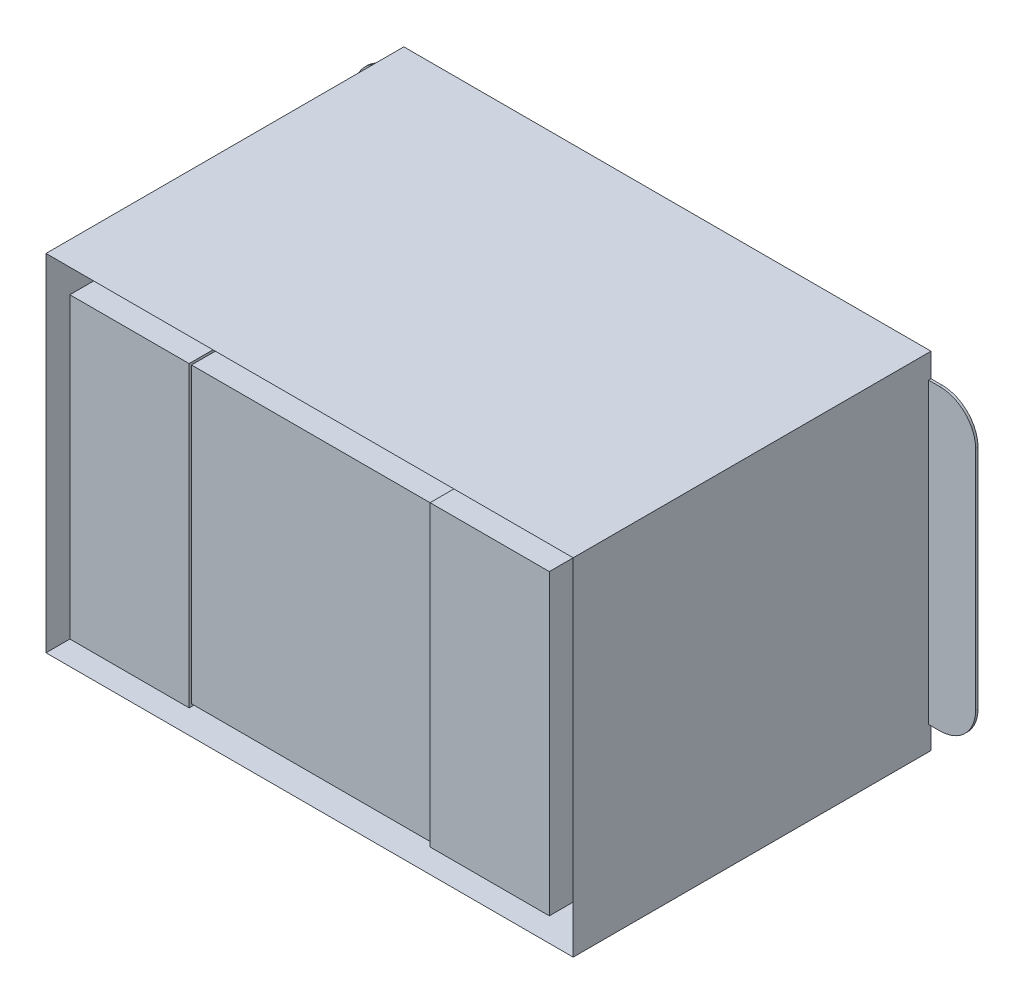
ISO-10303-21;
HEADER;
FILE_DESCRIPTION(('STEP AP214'),'2;1');
FILE_NAME('part.step','',(''),(''),'','','');
FILE_SCHEMA(('AUTOMOTIVE_DESIGN { 1 0 10303 214 1 1 1 1 }'));
ENDSEC;
DATA;
#1=APPLICATION_CONTEXT('core data for automotive mechanical design processes');
#2=APPLICATION_PROTOCOL_DEFINITION('international standard','automotive_design',2000,#1);
#3=PRODUCT_CONTEXT('',#1,'mechanical');
#4=PRODUCT('Part','Part','',(#3));
#5=PRODUCT_RELATED_PRODUCT_CATEGORY('part','',(#4));
#6=PRODUCT_DEFINITION_FORMATION('','',#4);
#7=PRODUCT_DEFINITION_CONTEXT('part definition',#1,'design');
#8=PRODUCT_DEFINITION('design','',#6,#7);
#9=PRODUCT_DEFINITION_SHAPE('','',#8);
#10=(LENGTH_UNIT() NAMED_UNIT(*) SI_UNIT(.MILLI.,.METRE.));
#11=(NAMED_UNIT(*) PLANE_ANGLE_UNIT() SI_UNIT($,.RADIAN.));
#12=(NAMED_UNIT(*) SI_UNIT($,.STERADIAN.) SOLID_ANGLE_UNIT());
#13=UNCERTAINTY_MEASURE_WITH_UNIT(LENGTH_MEASURE(1.E-05),#10,'distance_accuracy_value','');
#14=(GEOMETRIC_REPRESENTATION_CONTEXT(3) GLOBAL_UNCERTAINTY_ASSIGNED_CONTEXT((#13)) GLOBAL_UNIT_ASSIGNED_CONTEXT((#10,
#11,#12)) REPRESENTATION_CONTEXT('',''));
#15=CARTESIAN_POINT('',(0.,0.,0.));
#16=DIRECTION('',(0.,0.,1.));
#17=DIRECTION('',(1.,0.,0.));
#18=AXIS2_PLACEMENT_3D('',#15,#16,#17);
#19=CARTESIAN_POINT('',(-1.005,0.625,0.0762));
#20=DIRECTION('',(-1.,0.,0.));
#21=DIRECTION('',(0.,0.,1.));
#22=AXIS2_PLACEMENT_3D('',#19,#20,#21);
#23=PLANE('',#22);
#24=DIRECTION('',(0.,0.,1.));
#25=VECTOR('',#24,1.);
#26=CARTESIAN_POINT('',(-1.005,-0.625,0.0862));
#27=LINE('',#26,#25);
#28=CARTESIAN_POINT('',(-1.005,-0.625,0.0862));
#29=VERTEX_POINT('',#28);
#30=CARTESIAN_POINT('',(-1.005,-0.625,1.5762));
#31=VERTEX_POINT('',#30);
#32=EDGE_CURVE('P0_E291',#29,#31,#27,.T.);
#33=ORIENTED_EDGE('',*,*,#32,.T.);
#34=DIRECTION('',(0.,-1.,0.));
#35=VECTOR('',#34,1.);
#36=CARTESIAN_POINT('',(-1.005,0.625,1.5762));
#37=LINE('',#36,#35);
#38=CARTESIAN_POINT('',(-1.005,0.625,1.5762));
#39=VERTEX_POINT('',#38);
#40=EDGE_CURVE('P0_E220',#39,#31,#37,.T.);
#41=ORIENTED_EDGE('',*,*,#40,.F.);
#42=DIRECTION('',(0.,0.,1.));
#43=VECTOR('',#42,1.);
#44=CARTESIAN_POINT('',(-1.005,0.625,0.0862));
#45=LINE('',#44,#43);
#46=CARTESIAN_POINT('',(-1.005,0.625,0.0862));
#47=VERTEX_POINT('',#46);
#48=EDGE_CURVE('P0_E234',#47,#39,#45,.T.);
#49=ORIENTED_EDGE('',*,*,#48,.F.);
#50=DIRECTION('',(0.,-1.,0.));
#51=VECTOR('',#50,1.);
#52=CARTESIAN_POINT('',(-1.005,0.625,0.0862));
#53=LINE('',#52,#51);
#54=EDGE_CURVE('P0_E448',#47,#29,#53,.T.);
#55=ORIENTED_EDGE('',*,*,#54,.T.);
#56=EDGE_LOOP('',(#33,#41,#49,#55));
#57=FACE_BOUND('',#56,.T.);
#58=ADVANCED_FACE('P0_F17',(#57),#23,.T.);
#59=CARTESIAN_POINT('',(0.505,-0.625,0.0862));
#60=DIRECTION('',(1.,0.,0.));
#61=DIRECTION('',(0.,1.,0.));
#62=AXIS2_PLACEMENT_3D('',#59,#60,#61);
#63=PLANE('',#62);
#64=DIRECTION('',(0.,0.,1.));
#65=VECTOR('',#64,1.);
#66=CARTESIAN_POINT('',(0.505,0.615,0.0862));
#67=LINE('',#66,#65);
#68=CARTESIAN_POINT('',(0.505,0.615,0.0862));
#69=VERTEX_POINT('',#68);
#70=CARTESIAN_POINT('',(0.505,0.615,1.5662));
#71=VERTEX_POINT('',#70);
#72=EDGE_CURVE('P0_E262',#69,#71,#67,.T.);
#73=ORIENTED_EDGE('',*,*,#72,.T.);
#74=DIRECTION('',(0.,-1.,0.));
#75=VECTOR('',#74,1.);
#76=CARTESIAN_POINT('',(0.505,0.615,1.5662));
#77=LINE('',#76,#75);
#78=CARTESIAN_POINT('',(0.505,-0.615,1.5662));
#79=VERTEX_POINT('',#78);
#80=EDGE_CURVE('P0_E208',#71,#79,#77,.T.);
#81=ORIENTED_EDGE('',*,*,#80,.T.);
#82=DIRECTION('',(0.,0.,-1.));
#83=VECTOR('',#82,1.);
#84=CARTESIAN_POINT('',(0.505,-0.615,1.5662));
#85=LINE('',#84,#83);
#86=CARTESIAN_POINT('',(0.505,-0.615,0.0862));
#87=VERTEX_POINT('',#86);
#88=EDGE_CURVE('P0_E221',#79,#87,#85,.T.);
#89=ORIENTED_EDGE('',*,*,#88,.T.);
#90=DIRECTION('',(0.,1.,0.));
#91=VECTOR('',#90,1.);
#92=CARTESIAN_POINT('',(0.505,-0.615,0.0862));
#93=LINE('',#92,#91);
#94=EDGE_CURVE('P0_E11',#87,#69,#93,.T.);
#95=ORIENTED_EDGE('',*,*,#94,.T.);
#96=EDGE_LOOP('',(#73,#81,#89,#95));
#97=FACE_BOUND('',#96,.T.);
#98=DIRECTION('',(0.,0.,1.));
#99=VECTOR('',#98,1.);
#100=CARTESIAN_POINT('',(0.505,-0.625,0.0762));
#101=LINE('',#100,#99);
#102=CARTESIAN_POINT('',(0.505,-0.625,0.0762));
#103=VERTEX_POINT('',#102);
#104=CARTESIAN_POINT('',(0.505,-0.625,1.5762));
#105=VERTEX_POINT('',#104);
#106=EDGE_CURVE('P0_E207',#103,#105,#101,.T.);
#107=ORIENTED_EDGE('',*,*,#106,.T.);
#108=DIRECTION('',(0.,1.,0.));
#109=VECTOR('',#108,1.);
#110=CARTESIAN_POINT('',(0.505,-0.625,1.5762));
#111=LINE('',#110,#109);
#112=CARTESIAN_POINT('',(0.505,0.625,1.5762));
#113=VERTEX_POINT('',#112);
#114=EDGE_CURVE('P0_E219',#105,#113,#111,.T.);
#115=ORIENTED_EDGE('',*,*,#114,.T.);
#116=DIRECTION('',(0.,0.,1.));
#117=VECTOR('',#116,1.);
#118=CARTESIAN_POINT('',(0.505,0.625,0.0762));
#119=LINE('',#118,#117);
#120=CARTESIAN_POINT('',(0.505,0.625,0.0762));
#121=VERTEX_POINT('',#120);
#122=EDGE_CURVE('P0_E244',#121,#113,#119,.T.);
#123=ORIENTED_EDGE('',*,*,#122,.F.);
#124=DIRECTION('',(0.,1.,0.));
#125=VECTOR('',#124,1.);
#126=CARTESIAN_POINT('',(0.505,-0.625,0.0762));
#127=LINE('',#126,#125);
#128=EDGE_CURVE('P0_E277',#103,#121,#127,.T.);
#129=ORIENTED_EDGE('',*,*,#128,.F.);
#130=EDGE_LOOP('',(#107,#115,#123,#129));
#131=FACE_BOUND('',#130,.T.);
#132=ADVANCED_FACE('P0_F348',(#97,#131),#63,.F.);
#133=CARTESIAN_POINT('',(-0.505,-0.625,0.0862));
#134=DIRECTION('',(0.,0.,1.));
#135=DIRECTION('',(1.,0.,0.));
#136=AXIS2_PLACEMENT_3D('',#133,#134,#135);
#137=PLANE('',#136);
#138=DIRECTION('',(0.,1.,0.));
#139=VECTOR('',#138,1.);
#140=CARTESIAN_POINT('',(-0.505,-0.615,0.0862));
#141=LINE('',#140,#139);
#142=CARTESIAN_POINT('',(-0.505,-0.615,0.0862));
#143=VERTEX_POINT('',#142);
#144=CARTESIAN_POINT('',(-0.505,0.615,0.0862));
#145=VERTEX_POINT('',#144);
#146=EDGE_CURVE('P0_E296',#143,#145,#141,.T.);
#147=ORIENTED_EDGE('',*,*,#146,.T.);
#148=DIRECTION('',(1.,0.,0.));
#149=VECTOR('',#148,1.);
#150=CARTESIAN_POINT('',(-0.505,0.615,0.0862));
#151=LINE('',#150,#149);
#152=EDGE_CURVE('P0_E28',#145,#69,#151,.T.);
#153=ORIENTED_EDGE('',*,*,#152,.T.);
#154=ORIENTED_EDGE('',*,*,#94,.F.);
#155=DIRECTION('',(1.,0.,0.));
#156=VECTOR('',#155,1.);
#157=CARTESIAN_POINT('',(-0.505,-0.615,0.0862));
#158=LINE('',#157,#156);
#159=EDGE_CURVE('P0_E224',#143,#87,#158,.T.);
#160=ORIENTED_EDGE('',*,*,#159,.F.);
#161=EDGE_LOOP('',(#147,#153,#154,#160));
#162=FACE_BOUND('',#161,.T.);
#163=ADVANCED_FACE('P0_F19',(#162),#137,.F.);
#164=CARTESIAN_POINT('',(-0.505,0.615,0.0762));
#165=DIRECTION('',(0.,-1.,0.));
#166=DIRECTION('',(0.,0.,-1.));
#167=AXIS2_PLACEMENT_3D('',#164,#165,#166);
#168=PLANE('',#167);
#169=DIRECTION('',(0.,0.,1.));
#170=VECTOR('',#169,1.);
#171=CARTESIAN_POINT('',(-0.505,0.615,0.0862));
#172=LINE('',#171,#170);
#173=CARTESIAN_POINT('',(-0.505,0.615,1.5662));
#174=VERTEX_POINT('',#173);
#175=EDGE_CURVE('P0_E304',#145,#174,#172,.T.);
#176=ORIENTED_EDGE('',*,*,#175,.T.);
#177=DIRECTION('',(1.,0.,0.));
#178=VECTOR('',#177,1.);
#179=CARTESIAN_POINT('',(-0.505,0.615,1.5662));
#180=LINE('',#179,#178);
#181=EDGE_CURVE('P0_E211',#174,#71,#180,.T.);
#182=ORIENTED_EDGE('',*,*,#181,.T.);
#183=ORIENTED_EDGE('',*,*,#72,.F.);
#184=ORIENTED_EDGE('',*,*,#152,.F.);
#185=EDGE_LOOP('',(#176,#182,#183,#184));
#186=FACE_BOUND('',#185,.T.);
#187=ADVANCED_FACE('P0_F530',(#186),#168,.F.);
#188=CARTESIAN_POINT('',(-0.505,0.625,1.5662));
#189=DIRECTION('',(0.,0.,-1.));
#190=DIRECTION('',(0.,-1.,0.));
#191=AXIS2_PLACEMENT_3D('',#188,#189,#190);
#192=PLANE('',#191);
#193=DIRECTION('',(0.,-1.,0.));
#194=VECTOR('',#193,1.);
#195=CARTESIAN_POINT('',(-0.505,0.615,1.5662));
#196=LINE('',#195,#194);
#197=CARTESIAN_POINT('',(-0.505,-0.615,1.5662));
#198=VERTEX_POINT('',#197);
#199=EDGE_CURVE('P0_E333',#174,#198,#196,.T.);
#200=ORIENTED_EDGE('',*,*,#199,.T.);
#201=DIRECTION('',(1.,0.,0.));
#202=VECTOR('',#201,1.);
#203=CARTESIAN_POINT('',(-0.505,-0.615,1.5662));
#204=LINE('',#203,#202);
#205=EDGE_CURVE('P0_E212',#198,#79,#204,.T.);
#206=ORIENTED_EDGE('',*,*,#205,.T.);
#207=ORIENTED_EDGE('',*,*,#80,.F.);
#208=ORIENTED_EDGE('',*,*,#181,.F.);
#209=EDGE_LOOP('',(#200,#206,#207,#208));
#210=FACE_BOUND('',#209,.T.);
#211=ADVANCED_FACE('P0_F353',(#210),#192,.F.);
#212=CARTESIAN_POINT('',(-0.505,-0.615,1.5762));
#213=DIRECTION('',(0.,1.,0.));
#214=DIRECTION('',(1.,0.,0.));
#215=AXIS2_PLACEMENT_3D('',#212,#213,#214);
#216=PLANE('',#215);
#217=DIRECTION('',(0.,0.,-1.));
#218=VECTOR('',#217,1.);
#219=CARTESIAN_POINT('',(-0.505,-0.615,1.5662));
#220=LINE('',#219,#218);
#221=EDGE_CURVE('P0_E292',#198,#143,#220,.T.);
#222=ORIENTED_EDGE('',*,*,#221,.T.);
#223=ORIENTED_EDGE('',*,*,#159,.T.);
#224=ORIENTED_EDGE('',*,*,#88,.F.);
#225=ORIENTED_EDGE('',*,*,#205,.F.);
#226=EDGE_LOOP('',(#222,#223,#224,#225));
#227=FACE_BOUND('',#226,.T.);
#228=ADVANCED_FACE('P0_F342',(#227),#216,.F.);
#229=CARTESIAN_POINT('',(-0.505,-0.625,0.0762));
#230=DIRECTION('',(-1.,0.,0.));
#231=DIRECTION('',(0.,0.,1.));
#232=AXIS2_PLACEMENT_3D('',#229,#230,#231);
#233=PLANE('',#232);
#234=ORIENTED_EDGE('',*,*,#199,.F.);
#235=ORIENTED_EDGE('',*,*,#175,.F.);
#236=ORIENTED_EDGE('',*,*,#146,.F.);
#237=ORIENTED_EDGE('',*,*,#221,.F.);
#238=EDGE_LOOP('',(#234,#235,#236,#237));
#239=FACE_BOUND('',#238,.T.);
#240=DIRECTION('',(0.,0.,1.));
#241=VECTOR('',#240,1.);
#242=CARTESIAN_POINT('',(-0.505,0.625,0.0762));
#243=LINE('',#242,#241);
#244=CARTESIAN_POINT('',(-0.505,0.625,0.0762));
#245=VERTEX_POINT('',#244);
#246=CARTESIAN_POINT('',(-0.505,0.625,1.5762));
#247=VERTEX_POINT('',#246);
#248=EDGE_CURVE('P0_E255',#245,#247,#243,.T.);
#249=ORIENTED_EDGE('',*,*,#248,.T.);
#250=DIRECTION('',(0.,1.,0.));
#251=VECTOR('',#250,1.);
#252=CARTESIAN_POINT('',(-0.505,-0.625,1.5762));
#253=LINE('',#252,#251);
#254=CARTESIAN_POINT('',(-0.505,-0.625,1.5762));
#255=VERTEX_POINT('',#254);
#256=EDGE_CURVE('P0_E216',#255,#247,#253,.T.);
#257=ORIENTED_EDGE('',*,*,#256,.F.);
#258=DIRECTION('',(0.,0.,1.));
#259=VECTOR('',#258,1.);
#260=CARTESIAN_POINT('',(-0.505,-0.625,0.0762));
#261=LINE('',#260,#259);
#262=CARTESIAN_POINT('',(-0.505,-0.625,0.0762));
#263=VERTEX_POINT('',#262);
#264=EDGE_CURVE('P0_E200',#263,#255,#261,.T.);
#265=ORIENTED_EDGE('',*,*,#264,.F.);
#266=DIRECTION('',(0.,1.,0.));
#267=VECTOR('',#266,1.);
#268=CARTESIAN_POINT('',(-0.505,-0.625,0.0762));
#269=LINE('',#268,#267);
#270=EDGE_CURVE('P0_E263',#263,#245,#269,.T.);
#271=ORIENTED_EDGE('',*,*,#270,.T.);
#272=EDGE_LOOP('',(#249,#257,#265,#271));
#273=FACE_BOUND('',#272,.T.);
#274=ADVANCED_FACE('P0_F356',(#239,#273),#233,.F.);
#275=CARTESIAN_POINT('',(0.,0.,1.5762));
#276=DIRECTION('',(0.,0.,1.));
#277=DIRECTION('',(1.,0.,0.));
#278=AXIS2_PLACEMENT_3D('',#275,#276,#277);
#279=PLANE('',#278);
#280=DIRECTION('',(1.,0.,0.));
#281=VECTOR('',#280,1.);
#282=CARTESIAN_POINT('',(0.505,-0.625,1.5762));
#283=LINE('',#282,#281);
#284=CARTESIAN_POINT('',(1.005,-0.625,1.5762));
#285=VERTEX_POINT('',#284);
#286=EDGE_CURVE('P0_E21',#105,#285,#283,.T.);
#287=ORIENTED_EDGE('',*,*,#286,.T.);
#288=DIRECTION('',(0.,1.,0.));
#289=VECTOR('',#288,1.);
#290=CARTESIAN_POINT('',(1.005,-0.625,1.5762));
#291=LINE('',#290,#289);
#292=CARTESIAN_POINT('',(1.005,0.625,1.5762));
#293=VERTEX_POINT('',#292);
#294=EDGE_CURVE('P0_E308',#285,#293,#291,.T.);
#295=ORIENTED_EDGE('',*,*,#294,.T.);
#296=DIRECTION('',(-1.,0.,0.));
#297=VECTOR('',#296,1.);
#298=CARTESIAN_POINT('',(1.005,0.625,1.5762));
#299=LINE('',#298,#297);
#300=EDGE_CURVE('P0_E240',#293,#113,#299,.T.);
#301=ORIENTED_EDGE('',*,*,#300,.T.);
#302=ORIENTED_EDGE('',*,*,#114,.F.);
#303=EDGE_LOOP('',(#287,#295,#301,#302));
#304=FACE_BOUND('',#303,.T.);
#305=ADVANCED_FACE('P0_F481',(#304),#279,.T.);
#306=CARTESIAN_POINT('',(0.,0.,1.5762));
#307=DIRECTION('',(0.,0.,1.));
#308=DIRECTION('',(1.,0.,0.));
#309=AXIS2_PLACEMENT_3D('',#306,#307,#308);
#310=PLANE('',#309);
#311=DIRECTION('',(-1.,0.,0.));
#312=VECTOR('',#311,1.);
#313=CARTESIAN_POINT('',(-0.505,0.625,1.5762));
#314=LINE('',#313,#312);
#315=EDGE_CURVE('P0_E251',#247,#39,#314,.T.);
#316=ORIENTED_EDGE('',*,*,#315,.T.);
#317=ORIENTED_EDGE('',*,*,#40,.T.);
#318=DIRECTION('',(1.,0.,0.));
#319=VECTOR('',#318,1.);
#320=CARTESIAN_POINT('',(-1.005,-0.625,1.5762));
#321=LINE('',#320,#319);
#322=EDGE_CURVE('P0_E297',#31,#255,#321,.T.);
#323=ORIENTED_EDGE('',*,*,#322,.T.);
#324=ORIENTED_EDGE('',*,*,#256,.T.);
#325=EDGE_LOOP('',(#316,#317,#323,#324));
#326=FACE_BOUND('',#325,.T.);
#327=ADVANCED_FACE('P0_F483',(#326),#310,.T.);
#328=CARTESIAN_POINT('',(1.005,-0.625,0.0762));
#329=DIRECTION('',(1.,0.,0.));
#330=DIRECTION('',(0.,1.,0.));
#331=AXIS2_PLACEMENT_3D('',#328,#329,#330);
#332=PLANE('',#331);
#333=DIRECTION('',(0.,0.,1.));
#334=VECTOR('',#333,1.);
#335=CARTESIAN_POINT('',(1.005,0.625,0.0862));
#336=LINE('',#335,#334);
#337=CARTESIAN_POINT('',(1.005,0.625,0.0862));
#338=VERTEX_POINT('',#337);
#339=EDGE_CURVE('P0_E230',#338,#293,#336,.T.);
#340=ORIENTED_EDGE('',*,*,#339,.T.);
#341=ORIENTED_EDGE('',*,*,#294,.F.);
#342=DIRECTION('',(0.,0.,1.));
#343=VECTOR('',#342,1.);
#344=CARTESIAN_POINT('',(1.005,-0.625,0.0862));
#345=LINE('',#344,#343);
#346=CARTESIAN_POINT('',(1.005,-0.625,0.0862));
#347=VERTEX_POINT('',#346);
#348=EDGE_CURVE('P0_E191',#347,#285,#345,.T.);
#349=ORIENTED_EDGE('',*,*,#348,.F.);
#350=DIRECTION('',(0.,1.,0.));
#351=VECTOR('',#350,1.);
#352=CARTESIAN_POINT('',(1.005,-0.625,0.0862));
#353=LINE('',#352,#351);
#354=EDGE_CURVE('P0_E398',#347,#338,#353,.T.);
#355=ORIENTED_EDGE('',*,*,#354,.T.);
#356=EDGE_LOOP('',(#340,#341,#349,#355));
#357=FACE_BOUND('',#356,.T.);
#358=ADVANCED_FACE('P0_F395',(#357),#332,.T.);
#359=CARTESIAN_POINT('',(0.,0.,0.0862));
#360=DIRECTION('',(0.,0.,1.));
#361=DIRECTION('',(1.,0.,0.));
#362=AXIS2_PLACEMENT_3D('',#359,#360,#361);
#363=PLANE('',#362);
#364=DIRECTION('',(-1.,0.,0.));
#365=VECTOR('',#364,1.);
#366=CARTESIAN_POINT('',(-1.005,0.625,0.0862));
#367=LINE('',#366,#365);
#368=CARTESIAN_POINT('',(-1.152,0.625,0.0862));
#369=VERTEX_POINT('',#368);
#370=EDGE_CURVE('P0_E239',#47,#369,#367,.T.);
#371=ORIENTED_EDGE('',*,*,#370,.T.);
#372=CARTESIAN_POINT('',(-1.152000112061,0.4750001120613,0.0862));
#373=DIRECTION('',(0.,0.,1.));
#374=DIRECTION('',(7.47075740579016E-07,0.999999999999721,0.));
#375=AXIS2_PLACEMENT_3D('',#372,#373,#374);
#376=CIRCLE('',#375,0.1499998879388);
#377=CARTESIAN_POINT('',(-1.302,0.475,0.0862));
#378=VERTEX_POINT('',#377);
#379=EDGE_CURVE('P0_E170',#369,#378,#376,.T.);
#380=ORIENTED_EDGE('',*,*,#379,.T.);
#381=DIRECTION('',(0.,-1.,0.));
#382=VECTOR('',#381,1.);
#383=CARTESIAN_POINT('',(-1.302,0.475,0.0862));
#384=LINE('',#383,#382);
#385=CARTESIAN_POINT('',(-1.302,-0.475,0.0862));
#386=VERTEX_POINT('',#385);
#387=EDGE_CURVE('P0_E161',#378,#386,#384,.T.);
#388=ORIENTED_EDGE('',*,*,#387,.T.);
#389=CARTESIAN_POINT('',(-1.152000112061,-0.4750001120613,0.0862));
#390=DIRECTION('',(0.,0.,1.));
#391=DIRECTION('',(-0.999999999999721,7.47075741689316E-07,0.));
#392=AXIS2_PLACEMENT_3D('',#389,#390,#391);
#393=CIRCLE('',#392,0.1499998879388);
#394=CARTESIAN_POINT('',(-1.152,-0.625,0.0862));
#395=VERTEX_POINT('',#394);
#396=EDGE_CURVE('P0_E167',#386,#395,#393,.T.);
#397=ORIENTED_EDGE('',*,*,#396,.T.);
#398=DIRECTION('',(1.,0.,0.));
#399=VECTOR('',#398,1.);
#400=CARTESIAN_POINT('',(-1.152,-0.625,0.0862));
#401=LINE('',#400,#399);
#402=EDGE_CURVE('P0_E288',#395,#29,#401,.T.);
#403=ORIENTED_EDGE('',*,*,#402,.T.);
#404=ORIENTED_EDGE('',*,*,#54,.F.);
#405=EDGE_LOOP('',(#371,#380,#388,#397,#403,#404));
#406=FACE_BOUND('',#405,.T.);
#407=ADVANCED_FACE('P0_F164',(#406),#363,.T.);
#408=CARTESIAN_POINT('',(0.,0.,0.0862));
#409=DIRECTION('',(0.,0.,1.));
#410=DIRECTION('',(1.,0.,0.));
#411=AXIS2_PLACEMENT_3D('',#408,#409,#410);
#412=PLANE('',#411);
#413=DIRECTION('',(1.,0.,0.));
#414=VECTOR('',#413,1.);
#415=CARTESIAN_POINT('',(1.005,-0.625,0.0862));
#416=LINE('',#415,#414);
#417=CARTESIAN_POINT('',(1.152,-0.625,0.0862));
#418=VERTEX_POINT('',#417);
#419=EDGE_CURVE('P0_E197',#347,#418,#416,.T.);
#420=ORIENTED_EDGE('',*,*,#419,.T.);
#421=CARTESIAN_POINT('',(1.152000112061,-0.4750001120613,0.0862));
#422=DIRECTION('',(0.,0.,1.));
#423=DIRECTION('',(-7.47075740579016E-07,-0.999999999999721,0.));
#424=AXIS2_PLACEMENT_3D('',#421,#422,#423);
#425=CIRCLE('',#424,0.1499998879388);
#426=CARTESIAN_POINT('',(1.302,-0.475,0.0862));
#427=VERTEX_POINT('',#426);
#428=EDGE_CURVE('P0_E322',#418,#427,#425,.T.);
#429=ORIENTED_EDGE('',*,*,#428,.T.);
#430=DIRECTION('',(0.,1.,0.));
#431=VECTOR('',#430,1.);
#432=CARTESIAN_POINT('',(1.302,-0.475,0.0862));
#433=LINE('',#432,#431);
#434=CARTESIAN_POINT('',(1.302,0.475,0.0862));
#435=VERTEX_POINT('',#434);
#436=EDGE_CURVE('P0_E276',#427,#435,#433,.T.);
#437=ORIENTED_EDGE('',*,*,#436,.T.);
#438=CARTESIAN_POINT('',(1.152000112061,0.4750001120613,0.0862));
#439=DIRECTION('',(0.,0.,1.));
#440=DIRECTION('',(0.999999999999721,-7.47075741689316E-07,0.));
#441=AXIS2_PLACEMENT_3D('',#438,#439,#440);
#442=CIRCLE('',#441,0.1499998879388);
#443=CARTESIAN_POINT('',(1.152,0.625,0.0862));
#444=VERTEX_POINT('',#443);
#445=EDGE_CURVE('P0_E238',#435,#444,#442,.T.);
#446=ORIENTED_EDGE('',*,*,#445,.T.);
#447=DIRECTION('',(-1.,0.,0.));
#448=VECTOR('',#447,1.);
#449=CARTESIAN_POINT('',(1.152,0.625,0.0862));
#450=LINE('',#449,#448);
#451=EDGE_CURVE('P0_E225',#444,#338,#450,.T.);
#452=ORIENTED_EDGE('',*,*,#451,.T.);
#453=ORIENTED_EDGE('',*,*,#354,.F.);
#454=EDGE_LOOP('',(#420,#429,#437,#446,#452,#453));
#455=FACE_BOUND('',#454,.T.);
#456=ADVANCED_FACE('P0_F376',(#455),#412,.T.);
#457=CARTESIAN_POINT('',(1.152000112061,-0.4750001120613,0.0762));
#458=DIRECTION('',(0.,0.,1.));
#459=DIRECTION('',(1.,0.,0.));
#460=AXIS2_PLACEMENT_3D('',#457,#458,#459);
#461=CYLINDRICAL_SURFACE('',#460,0.1499998879388);
#462=DIRECTION('',(0.,0.,1.));
#463=VECTOR('',#462,1.);
#464=CARTESIAN_POINT('',(1.302,-0.475,0.0762));
#465=LINE('',#464,#463);
#466=CARTESIAN_POINT('',(1.302,-0.475,0.0762));
#467=VERTEX_POINT('',#466);
#468=EDGE_CURVE('P0_E318',#467,#427,#465,.T.);
#469=ORIENTED_EDGE('',*,*,#468,.T.);
#470=ORIENTED_EDGE('',*,*,#428,.F.);
#471=DIRECTION('',(0.,0.,1.));
#472=VECTOR('',#471,1.);
#473=CARTESIAN_POINT('',(1.152,-0.625,0.0762));
#474=LINE('',#473,#472);
#475=CARTESIAN_POINT('',(1.152,-0.625,0.0762));
#476=VERTEX_POINT('',#475);
#477=EDGE_CURVE('P0_E203',#476,#418,#474,.T.);
#478=ORIENTED_EDGE('',*,*,#477,.F.);
#479=CARTESIAN_POINT('',(1.152000112061,-0.4750001120613,0.0762));
#480=DIRECTION('',(0.,0.,1.));
#481=DIRECTION('',(-7.47075740579016E-07,-0.999999999999721,0.));
#482=AXIS2_PLACEMENT_3D('',#479,#480,#481);
#483=CIRCLE('',#482,0.1499998879388);
#484=EDGE_CURVE('P0_E249',#476,#467,#483,.T.);
#485=ORIENTED_EDGE('',*,*,#484,.T.);
#486=EDGE_LOOP('',(#469,#470,#478,#485));
#487=FACE_BOUND('',#486,.T.);
#488=ADVANCED_FACE('P0_F472',(#487),#461,.T.);
#489=CARTESIAN_POINT('',(1.302,-0.475,0.0762));
#490=DIRECTION('',(1.,0.,0.));
#491=DIRECTION('',(0.,1.,0.));
#492=AXIS2_PLACEMENT_3D('',#489,#490,#491);
#493=PLANE('',#492);
#494=DIRECTION('',(0.,0.,1.));
#495=VECTOR('',#494,1.);
#496=CARTESIAN_POINT('',(1.302,0.475,0.0762));
#497=LINE('',#496,#495);
#498=CARTESIAN_POINT('',(1.302,0.475,0.0762));
#499=VERTEX_POINT('',#498);
#500=EDGE_CURVE('P0_E272',#499,#435,#497,.T.);
#501=ORIENTED_EDGE('',*,*,#500,.T.);
#502=ORIENTED_EDGE('',*,*,#436,.F.);
#503=ORIENTED_EDGE('',*,*,#468,.F.);
#504=DIRECTION('',(0.,1.,0.));
#505=VECTOR('',#504,1.);
#506=CARTESIAN_POINT('',(1.302,-0.475,0.0762));
#507=LINE('',#506,#505);
#508=EDGE_CURVE('P0_E245',#467,#499,#507,.T.);
#509=ORIENTED_EDGE('',*,*,#508,.T.);
#510=EDGE_LOOP('',(#501,#502,#503,#509));
#511=FACE_BOUND('',#510,.T.);
#512=ADVANCED_FACE('P0_F476',(#511),#493,.T.);
#513=CARTESIAN_POINT('',(1.152000112061,0.4750001120613,0.0762));
#514=DIRECTION('',(0.,0.,1.));
#515=DIRECTION('',(1.,0.,0.));
#516=AXIS2_PLACEMENT_3D('',#513,#514,#515);
#517=CYLINDRICAL_SURFACE('',#516,0.1499998879388);
#518=DIRECTION('',(0.,0.,1.));
#519=VECTOR('',#518,1.);
#520=CARTESIAN_POINT('',(1.152,0.625,0.0762));
#521=LINE('',#520,#519);
#522=CARTESIAN_POINT('',(1.152,0.625,0.0762));
#523=VERTEX_POINT('',#522);
#524=EDGE_CURVE('P0_E229',#523,#444,#521,.T.);
#525=ORIENTED_EDGE('',*,*,#524,.T.);
#526=ORIENTED_EDGE('',*,*,#445,.F.);
#527=ORIENTED_EDGE('',*,*,#500,.F.);
#528=CARTESIAN_POINT('',(1.152000112061,0.4750001120613,0.0762));
#529=DIRECTION('',(0.,0.,1.));
#530=DIRECTION('',(0.999999999999721,-7.47075741689316E-07,0.));
#531=AXIS2_PLACEMENT_3D('',#528,#529,#530);
#532=CIRCLE('',#531,0.1499998879388);
#533=EDGE_CURVE('P0_E250',#499,#523,#532,.T.);
#534=ORIENTED_EDGE('',*,*,#533,.T.);
#535=EDGE_LOOP('',(#525,#526,#527,#534));
#536=FACE_BOUND('',#535,.T.);
#537=ADVANCED_FACE('P0_F385',(#536),#517,.T.);
#538=CARTESIAN_POINT('',(1.005,0.625,0.0762));
#539=DIRECTION('',(0.,1.,0.));
#540=DIRECTION('',(1.,0.,0.));
#541=AXIS2_PLACEMENT_3D('',#538,#539,#540);
#542=PLANE('',#541);
#543=ORIENTED_EDGE('',*,*,#315,.F.);
#544=ORIENTED_EDGE('',*,*,#248,.F.);
#545=DIRECTION('',(1.,0.,0.));
#546=VECTOR('',#545,1.);
#547=CARTESIAN_POINT('',(-1.152,0.625,0.0762));
#548=LINE('',#547,#546);
#549=CARTESIAN_POINT('',(-1.152,0.625,0.0762));
#550=VERTEX_POINT('',#549);
#551=EDGE_CURVE('P0_E369',#550,#245,#548,.T.);
#552=ORIENTED_EDGE('',*,*,#551,.F.);
#553=DIRECTION('',(0.,0.,1.));
#554=VECTOR('',#553,1.);
#555=CARTESIAN_POINT('',(-1.152,0.625,0.0762));
#556=LINE('',#555,#554);
#557=EDGE_CURVE('P0_E315',#550,#369,#556,.T.);
#558=ORIENTED_EDGE('',*,*,#557,.T.);
#559=ORIENTED_EDGE('',*,*,#370,.F.);
#560=ORIENTED_EDGE('',*,*,#48,.T.);
#561=EDGE_LOOP('',(#543,#544,#552,#558,#559,#560));
#562=FACE_BOUND('',#561,.T.);
#563=ADVANCED_FACE('P0_F502',(#562),#542,.T.);
#564=CARTESIAN_POINT('',(1.005,0.625,0.0762));
#565=DIRECTION('',(0.,1.,0.));
#566=DIRECTION('',(1.,0.,0.));
#567=AXIS2_PLACEMENT_3D('',#564,#565,#566);
#568=PLANE('',#567);
#569=ORIENTED_EDGE('',*,*,#122,.T.);
#570=ORIENTED_EDGE('',*,*,#300,.F.);
#571=ORIENTED_EDGE('',*,*,#339,.F.);
#572=ORIENTED_EDGE('',*,*,#451,.F.);
#573=ORIENTED_EDGE('',*,*,#524,.F.);
#574=DIRECTION('',(1.,0.,0.));
#575=VECTOR('',#574,1.);
#576=CARTESIAN_POINT('',(0.505,0.625,0.0762));
#577=LINE('',#576,#575);
#578=EDGE_CURVE('P0_E280',#121,#523,#577,.T.);
#579=ORIENTED_EDGE('',*,*,#578,.F.);
#580=EDGE_LOOP('',(#569,#570,#571,#572,#573,#579));
#581=FACE_BOUND('',#580,.T.);
#582=ADVANCED_FACE('P0_F391',(#581),#568,.T.);
#583=CARTESIAN_POINT('',(-1.152000112061,0.4750001120613,0.0762));
#584=DIRECTION('',(0.,0.,1.));
#585=DIRECTION('',(1.,0.,0.));
#586=AXIS2_PLACEMENT_3D('',#583,#584,#585);
#587=CYLINDRICAL_SURFACE('',#586,0.1499998879388);
#588=DIRECTION('',(0.,0.,1.));
#589=VECTOR('',#588,1.);
#590=CARTESIAN_POINT('',(-1.302,0.475,0.0762));
#591=LINE('',#590,#589);
#592=CARTESIAN_POINT('',(-1.302,0.475,0.0762));
#593=VERTEX_POINT('',#592);
#594=EDGE_CURVE('P0_E175',#593,#378,#591,.T.);
#595=ORIENTED_EDGE('',*,*,#594,.T.);
#596=ORIENTED_EDGE('',*,*,#379,.F.);
#597=ORIENTED_EDGE('',*,*,#557,.F.);
#598=CARTESIAN_POINT('',(-1.152000112061,0.4750001120613,0.0762));
#599=DIRECTION('',(0.,0.,1.));
#600=DIRECTION('',(7.47075740579016E-07,0.999999999999721,0.));
#601=AXIS2_PLACEMENT_3D('',#598,#599,#600);
#602=CIRCLE('',#601,0.1499998879388);
#603=EDGE_CURVE('P0_E258',#550,#593,#602,.T.);
#604=ORIENTED_EDGE('',*,*,#603,.T.);
#605=EDGE_LOOP('',(#595,#596,#597,#604));
#606=FACE_BOUND('',#605,.T.);
#607=ADVANCED_FACE('P0_F432',(#606),#587,.T.);
#608=CARTESIAN_POINT('',(-1.302,0.475,0.0762));
#609=DIRECTION('',(-1.,0.,0.));
#610=DIRECTION('',(0.,0.,1.));
#611=AXIS2_PLACEMENT_3D('',#608,#609,#610);
#612=PLANE('',#611);
#613=DIRECTION('',(0.,0.,1.));
#614=VECTOR('',#613,1.);
#615=CARTESIAN_POINT('',(-1.302,-0.475,0.0762));
#616=LINE('',#615,#614);
#617=CARTESIAN_POINT('',(-1.302,-0.475,0.0762));
#618=VERTEX_POINT('',#617);
#619=EDGE_CURVE('P0_E176',#618,#386,#616,.T.);
#620=ORIENTED_EDGE('',*,*,#619,.T.);
#621=ORIENTED_EDGE('',*,*,#387,.F.);
#622=ORIENTED_EDGE('',*,*,#594,.F.);
#623=DIRECTION('',(0.,-1.,0.));
#624=VECTOR('',#623,1.);
#625=CARTESIAN_POINT('',(-1.302,0.475,0.0762));
#626=LINE('',#625,#624);
#627=EDGE_CURVE('P0_E181',#593,#618,#626,.T.);
#628=ORIENTED_EDGE('',*,*,#627,.T.);
#629=EDGE_LOOP('',(#620,#621,#622,#628));
#630=FACE_BOUND('',#629,.T.);
#631=ADVANCED_FACE('P0_F179',(#630),#612,.T.);
#632=CARTESIAN_POINT('',(-1.152000112061,-0.4750001120613,0.0762));
#633=DIRECTION('',(0.,0.,1.));
#634=DIRECTION('',(1.,0.,0.));
#635=AXIS2_PLACEMENT_3D('',#632,#633,#634);
#636=CYLINDRICAL_SURFACE('',#635,0.1499998879388);
#637=DIRECTION('',(0.,0.,1.));
#638=VECTOR('',#637,1.);
#639=CARTESIAN_POINT('',(-1.152,-0.625,0.0762));
#640=LINE('',#639,#638);
#641=CARTESIAN_POINT('',(-1.152,-0.625,0.0762));
#642=VERTEX_POINT('',#641);
#643=EDGE_CURVE('P0_E188',#642,#395,#640,.T.);
#644=ORIENTED_EDGE('',*,*,#643,.T.);
#645=ORIENTED_EDGE('',*,*,#396,.F.);
#646=ORIENTED_EDGE('',*,*,#619,.F.);
#647=CARTESIAN_POINT('',(-1.152000112061,-0.4750001120613,0.0762));
#648=DIRECTION('',(0.,0.,1.));
#649=DIRECTION('',(-0.999999999999721,7.47075741689316E-07,0.));
#650=AXIS2_PLACEMENT_3D('',#647,#648,#649);
#651=CIRCLE('',#650,0.1499998879388);
#652=EDGE_CURVE('P0_E259',#618,#642,#651,.T.);
#653=ORIENTED_EDGE('',*,*,#652,.T.);
#654=EDGE_LOOP('',(#644,#645,#646,#653));
#655=FACE_BOUND('',#654,.T.);
#656=ADVANCED_FACE('P0_F187',(#655),#636,.T.);
#657=CARTESIAN_POINT('',(-1.005,-0.625,0.0762));
#658=DIRECTION('',(0.,-1.,0.));
#659=DIRECTION('',(0.,0.,-1.));
#660=AXIS2_PLACEMENT_3D('',#657,#658,#659);
#661=PLANE('',#660);
#662=ORIENTED_EDGE('',*,*,#286,.F.);
#663=ORIENTED_EDGE('',*,*,#106,.F.);
#664=DIRECTION('',(-1.,0.,0.));
#665=VECTOR('',#664,1.);
#666=CARTESIAN_POINT('',(1.152,-0.625,0.0762));
#667=LINE('',#666,#665);
#668=EDGE_CURVE('P0_E268',#476,#103,#667,.T.);
#669=ORIENTED_EDGE('',*,*,#668,.F.);
#670=ORIENTED_EDGE('',*,*,#477,.T.);
#671=ORIENTED_EDGE('',*,*,#419,.F.);
#672=ORIENTED_EDGE('',*,*,#348,.T.);
#673=EDGE_LOOP('',(#662,#663,#669,#670,#671,#672));
#674=FACE_BOUND('',#673,.T.);
#675=ADVANCED_FACE('P0_F519',(#674),#661,.T.);
#676=CARTESIAN_POINT('',(-1.005,-0.625,0.0762));
#677=DIRECTION('',(0.,-1.,0.));
#678=DIRECTION('',(0.,0.,-1.));
#679=AXIS2_PLACEMENT_3D('',#676,#677,#678);
#680=PLANE('',#679);
#681=ORIENTED_EDGE('',*,*,#264,.T.);
#682=ORIENTED_EDGE('',*,*,#322,.F.);
#683=ORIENTED_EDGE('',*,*,#32,.F.);
#684=ORIENTED_EDGE('',*,*,#402,.F.);
#685=ORIENTED_EDGE('',*,*,#643,.F.);
#686=DIRECTION('',(-1.,0.,0.));
#687=VECTOR('',#686,1.);
#688=CARTESIAN_POINT('',(-0.505,-0.625,0.0762));
#689=LINE('',#688,#687);
#690=EDGE_CURVE('P0_E267',#263,#642,#689,.T.);
#691=ORIENTED_EDGE('',*,*,#690,.F.);
#692=EDGE_LOOP('',(#681,#682,#683,#684,#685,#691));
#693=FACE_BOUND('',#692,.T.);
#694=ADVANCED_FACE('P0_F516',(#693),#680,.T.);
#695=CARTESIAN_POINT('',(0.,0.,0.0762));
#696=DIRECTION('',(0.,0.,1.));
#697=DIRECTION('',(1.,0.,0.));
#698=AXIS2_PLACEMENT_3D('',#695,#696,#697);
#699=PLANE('',#698);
#700=ORIENTED_EDGE('',*,*,#270,.F.);
#701=ORIENTED_EDGE('',*,*,#690,.T.);
#702=ORIENTED_EDGE('',*,*,#652,.F.);
#703=ORIENTED_EDGE('',*,*,#627,.F.);
#704=ORIENTED_EDGE('',*,*,#603,.F.);
#705=ORIENTED_EDGE('',*,*,#551,.T.);
#706=EDGE_LOOP('',(#700,#701,#702,#703,#704,#705));
#707=FACE_BOUND('',#706,.T.);
#708=ADVANCED_FACE('P0_F437',(#707),#699,.F.);
#709=CARTESIAN_POINT('',(0.,0.,0.0762));
#710=DIRECTION('',(0.,0.,1.));
#711=DIRECTION('',(1.,0.,0.));
#712=AXIS2_PLACEMENT_3D('',#709,#710,#711);
#713=PLANE('',#712);
#714=ORIENTED_EDGE('',*,*,#128,.T.);
#715=ORIENTED_EDGE('',*,*,#578,.T.);
#716=ORIENTED_EDGE('',*,*,#533,.F.);
#717=ORIENTED_EDGE('',*,*,#508,.F.);
#718=ORIENTED_EDGE('',*,*,#484,.F.);
#719=ORIENTED_EDGE('',*,*,#668,.T.);
#720=EDGE_LOOP('',(#714,#715,#716,#717,#718,#719));
#721=FACE_BOUND('',#720,.T.);
#722=ADVANCED_FACE('P0_F478',(#721),#713,.F.);
#723=CLOSED_SHELL('',(#58,#132,#163,#187,#211,#228,#274,#305,#327,#358,#407,#456,#488,#512,#537,
#563,#582,#607,#631,#656,#675,#694,#708,#722));
#724=MANIFOLD_SOLID_BREP('P0_B1',#723);
#725=CARTESIAN_POINT('',(-1.105,-0.725,0.0762));
#726=DIRECTION('',(0.,-1.,0.));
#727=DIRECTION('',(0.,0.,-1.));
#728=AXIS2_PLACEMENT_3D('',#725,#726,#727);
#729=PLANE('',#728);
#730=CARTESIAN_POINT('',(-1.105,-0.725,1.5762));
#731=DIRECTION('',(0.,0.,-1.));
#732=VECTOR('',#731,1.);
#733=LINE('',#730,#732);
#734=CARTESIAN_POINT('',(-1.105,-0.725,1.5762));
#735=VERTEX_POINT('',#734);
#736=CARTESIAN_POINT('',(-1.105,-0.725,0.0762));
#737=VERTEX_POINT('',#736);
#738=EDGE_CURVE('P1_E29',#735,#737,#733,.T.);
#739=ORIENTED_EDGE('',*,*,#738,.T.);
#740=CARTESIAN_POINT('',(-1.105,-0.725,0.0762));
#741=DIRECTION('',(1.,0.,0.));
#742=VECTOR('',#741,1.);
#743=LINE('',#740,#742);
#744=CARTESIAN_POINT('',(1.105,-0.725,0.0762));
#745=VERTEX_POINT('',#744);
#746=EDGE_CURVE('P1_E11',#737,#745,#743,.T.);
#747=ORIENTED_EDGE('',*,*,#746,.T.);
#748=CARTESIAN_POINT('',(1.105,-0.725,0.0762));
#749=DIRECTION('',(0.,0.,1.));
#750=VECTOR('',#749,1.);
#751=LINE('',#748,#750);
#752=CARTESIAN_POINT('',(1.105,-0.725,1.5762));
#753=VERTEX_POINT('',#752);
#754=EDGE_CURVE('P1_E79',#745,#753,#751,.T.);
#755=ORIENTED_EDGE('',*,*,#754,.T.);
#756=CARTESIAN_POINT('',(1.105,-0.725,1.5762));
#757=DIRECTION('',(-1.,0.,0.));
#758=VECTOR('',#757,1.);
#759=LINE('',#756,#758);
#760=EDGE_CURVE('P1_E122',#753,#735,#759,.T.);
#761=ORIENTED_EDGE('',*,*,#760,.T.);
#762=EDGE_LOOP('',(#739,#747,#755,#761));
#763=FACE_BOUND('',#762,.T.);
#764=ADVANCED_FACE('P1_F18',(#763),#729,.T.);
#765=CARTESIAN_POINT('',(-1.105,0.725,0.0762));
#766=DIRECTION('',(-1.,0.,0.));
#767=DIRECTION('',(0.,0.,1.));
#768=AXIS2_PLACEMENT_3D('',#765,#766,#767);
#769=PLANE('',#768);
#770=CARTESIAN_POINT('',(-1.105,0.725,1.5762));
#771=DIRECTION('',(0.,0.,-1.));
#772=VECTOR('',#771,1.);
#773=LINE('',#770,#772);
#774=CARTESIAN_POINT('',(-1.105,0.725,1.5762));
#775=VERTEX_POINT('',#774);
#776=CARTESIAN_POINT('',(-1.105,0.725,0.0762));
#777=VERTEX_POINT('',#776);
#778=EDGE_CURVE('P1_E190',#775,#777,#773,.T.);
#779=ORIENTED_EDGE('',*,*,#778,.T.);
#780=CARTESIAN_POINT('',(-1.105,0.725,0.0762));
#781=DIRECTION('',(0.,-1.,0.));
#782=VECTOR('',#781,1.);
#783=LINE('',#780,#782);
#784=EDGE_CURVE('P1_E37',#777,#737,#783,.T.);
#785=ORIENTED_EDGE('',*,*,#784,.T.);
#786=ORIENTED_EDGE('',*,*,#738,.F.);
#787=CARTESIAN_POINT('',(-1.105,-0.725,1.5762));
#788=DIRECTION('',(0.,1.,0.));
#789=VECTOR('',#788,1.);
#790=LINE('',#787,#789);
#791=EDGE_CURVE('P1_E82',#735,#775,#790,.T.);
#792=ORIENTED_EDGE('',*,*,#791,.T.);
#793=EDGE_LOOP('',(#779,#785,#786,#792));
#794=FACE_BOUND('',#793,.T.);
#795=ADVANCED_FACE('P1_F99',(#794),#769,.T.);
#796=CARTESIAN_POINT('',(1.105,-0.725,0.0762));
#797=DIRECTION('',(1.,0.,0.));
#798=DIRECTION('',(0.,1.,0.));
#799=AXIS2_PLACEMENT_3D('',#796,#797,#798);
#800=PLANE('',#799);
#801=ORIENTED_EDGE('',*,*,#754,.F.);
#802=CARTESIAN_POINT('',(1.105,-0.725,0.0762));
#803=DIRECTION('',(0.,1.,0.));
#804=VECTOR('',#803,1.);
#805=LINE('',#802,#804);
#806=CARTESIAN_POINT('',(1.105,0.725,0.0762));
#807=VERTEX_POINT('',#806);
#808=EDGE_CURVE('P1_E75',#745,#807,#805,.T.);
#809=ORIENTED_EDGE('',*,*,#808,.T.);
#810=CARTESIAN_POINT('',(1.105,0.725,0.0762));
#811=DIRECTION('',(0.,0.,1.));
#812=VECTOR('',#811,1.);
#813=LINE('',#810,#812);
#814=CARTESIAN_POINT('',(1.105,0.725,1.5762));
#815=VERTEX_POINT('',#814);
#816=EDGE_CURVE('P1_E61',#807,#815,#813,.T.);
#817=ORIENTED_EDGE('',*,*,#816,.T.);
#818=CARTESIAN_POINT('',(1.105,0.725,1.5762));
#819=DIRECTION('',(0.,-1.,0.));
#820=VECTOR('',#819,1.);
#821=LINE('',#818,#820);
#822=EDGE_CURVE('P1_E70',#815,#753,#821,.T.);
#823=ORIENTED_EDGE('',*,*,#822,.T.);
#824=EDGE_LOOP('',(#801,#809,#817,#823));
#825=FACE_BOUND('',#824,.T.);
#826=ADVANCED_FACE('P1_F77',(#825),#800,.T.);
#827=CARTESIAN_POINT('',(1.105,0.725,0.0762));
#828=DIRECTION('',(0.,1.,0.));
#829=DIRECTION('',(1.,0.,0.));
#830=AXIS2_PLACEMENT_3D('',#827,#828,#829);
#831=PLANE('',#830);
#832=ORIENTED_EDGE('',*,*,#816,.F.);
#833=CARTESIAN_POINT('',(1.105,0.725,0.0762));
#834=DIRECTION('',(-1.,0.,0.));
#835=VECTOR('',#834,1.);
#836=LINE('',#833,#835);
#837=EDGE_CURVE('P1_E64',#807,#777,#836,.T.);
#838=ORIENTED_EDGE('',*,*,#837,.T.);
#839=ORIENTED_EDGE('',*,*,#778,.F.);
#840=CARTESIAN_POINT('',(-1.105,0.725,1.5762));
#841=DIRECTION('',(1.,0.,0.));
#842=VECTOR('',#841,1.);
#843=LINE('',#840,#842);
#844=EDGE_CURVE('P1_E58',#775,#815,#843,.T.);
#845=ORIENTED_EDGE('',*,*,#844,.T.);
#846=EDGE_LOOP('',(#832,#838,#839,#845));
#847=FACE_BOUND('',#846,.T.);
#848=ADVANCED_FACE('P1_F19',(#847),#831,.T.);
#849=OPEN_SHELL('',(#764,#795,#826,#848));
#850=SHELL_BASED_SURFACE_MODEL('P1_B1',(#849));
#851=ADVANCED_BREP_SHAPE_REPRESENTATION('',(#18,#724),#14);
#852=MANIFOLD_SURFACE_SHAPE_REPRESENTATION('',(#18,#850),#14);
#853=SHAPE_REPRESENTATION('',(#18),#14);
#854=SHAPE_DEFINITION_REPRESENTATION(#9,#853);
#855=SHAPE_REPRESENTATION_RELATIONSHIP('','',#853,#851);
#856=SHAPE_REPRESENTATION_RELATIONSHIP('','',#853,#852);
ENDSEC;
END-ISO-10303-21;
